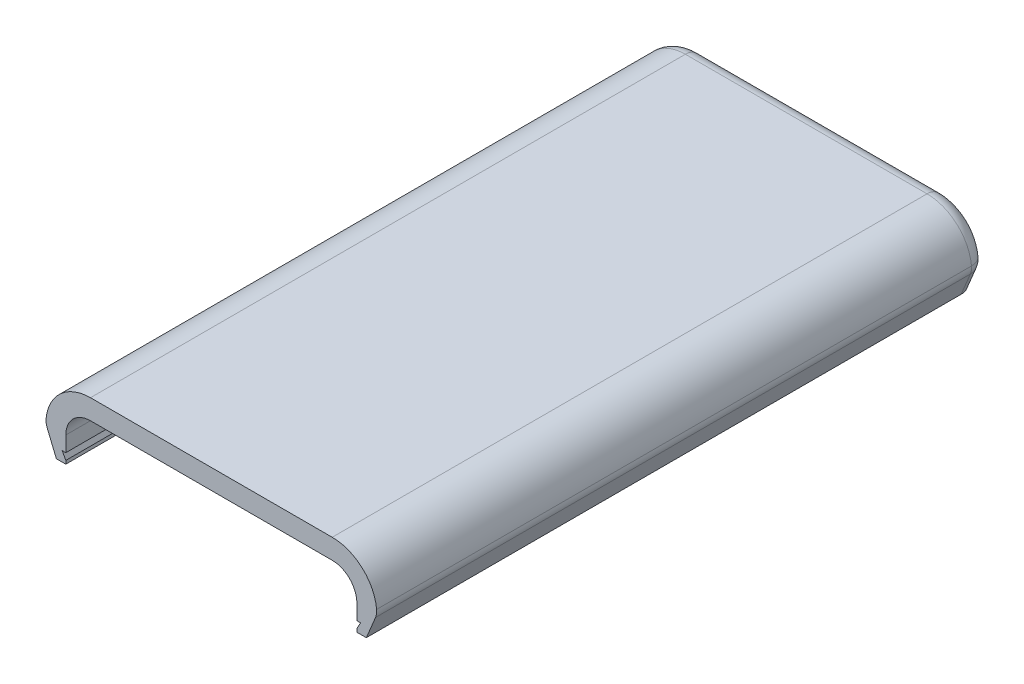
ISO-10303-21;
HEADER;
FILE_DESCRIPTION(('STEP AP214'),'2;1');
FILE_NAME('part.step','',(''),(''),'','','');
FILE_SCHEMA(('AUTOMOTIVE_DESIGN { 1 0 10303 214 1 1 1 1 }'));
ENDSEC;
DATA;
#1=APPLICATION_CONTEXT('core data for automotive mechanical design processes');
#2=APPLICATION_PROTOCOL_DEFINITION('international standard','automotive_design',2000,#1);
#3=PRODUCT_CONTEXT('',#1,'mechanical');
#4=PRODUCT('Part','Part','',(#3));
#5=PRODUCT_RELATED_PRODUCT_CATEGORY('part','',(#4));
#6=PRODUCT_DEFINITION_FORMATION('','',#4);
#7=PRODUCT_DEFINITION_CONTEXT('part definition',#1,'design');
#8=PRODUCT_DEFINITION('design','',#6,#7);
#9=PRODUCT_DEFINITION_SHAPE('','',#8);
#10=(LENGTH_UNIT() NAMED_UNIT(*) SI_UNIT(.MILLI.,.METRE.));
#11=(NAMED_UNIT(*) PLANE_ANGLE_UNIT() SI_UNIT($,.RADIAN.));
#12=(NAMED_UNIT(*) SI_UNIT($,.STERADIAN.) SOLID_ANGLE_UNIT());
#13=UNCERTAINTY_MEASURE_WITH_UNIT(LENGTH_MEASURE(1.E-05),#10,'distance_accuracy_value','');
#14=(GEOMETRIC_REPRESENTATION_CONTEXT(3) GLOBAL_UNCERTAINTY_ASSIGNED_CONTEXT((#13)) GLOBAL_UNIT_ASSIGNED_CONTEXT((#10,
#11,#12)) REPRESENTATION_CONTEXT('',''));
#15=CARTESIAN_POINT('',(0.,0.,0.));
#16=DIRECTION('',(0.,0.,1.));
#17=DIRECTION('',(1.,0.,0.));
#18=AXIS2_PLACEMENT_3D('',#15,#16,#17);
#19=CARTESIAN_POINT('',(0.,0.,116.3));
#20=DIRECTION('',(0.,1.,0.));
#21=DIRECTION('',(0.,0.,1.));
#22=AXIS2_PLACEMENT_3D('',#19,#20,#21);
#23=PLANE('',#22);
#24=DIRECTION('',(0.,0.,-1.));
#25=VECTOR('',#24,1.);
#26=CARTESIAN_POINT('',(0.,0.,116.3));
#27=LINE('',#26,#25);
#28=CARTESIAN_POINT('',(0.,0.,116.3));
#29=VERTEX_POINT('',#28);
#30=CARTESIAN_POINT('',(0.,0.,3.));
#31=VERTEX_POINT('',#30);
#32=EDGE_CURVE('E367',#29,#31,#27,.T.);
#33=ORIENTED_EDGE('',*,*,#32,.T.);
#34=CARTESIAN_POINT('',(3.24800863562673,0.,3.));
#35=DIRECTION('',(0.,1.,0.));
#36=DIRECTION('',(1.,0.,0.));
#37=AXIS2_PLACEMENT_3D('',#34,#35,#36);
#38=ELLIPSE('',#37,3.24800863562673,3.);
#39=CARTESIAN_POINT('',(3.24800863562673,0.,0.));
#40=VERTEX_POINT('',#39);
#41=EDGE_CURVE('E381',#31,#40,#38,.F.);
#42=ORIENTED_EDGE('',*,*,#41,.T.);
#43=DIRECTION('',(1.,0.,0.));
#44=VECTOR('',#43,1.);
#45=CARTESIAN_POINT('',(0.,0.,0.));
#46=LINE('',#45,#44);
#47=CARTESIAN_POINT('',(55.7919913643733,0.,0.));
#48=VERTEX_POINT('',#47);
#49=EDGE_CURVE('E354',#40,#48,#46,.T.);
#50=ORIENTED_EDGE('',*,*,#49,.T.);
#51=CARTESIAN_POINT('',(55.7919913643733,0.,3.));
#52=DIRECTION('',(0.,1.,0.));
#53=DIRECTION('',(1.,0.,0.));
#54=AXIS2_PLACEMENT_3D('',#51,#52,#53);
#55=ELLIPSE('',#54,3.24800863562673,3.);
#56=CARTESIAN_POINT('',(59.04,0.,3.));
#57=VERTEX_POINT('',#56);
#58=EDGE_CURVE('E378',#48,#57,#55,.F.);
#59=ORIENTED_EDGE('',*,*,#58,.T.);
#60=DIRECTION('',(0.,0.,-1.));
#61=VECTOR('',#60,1.);
#62=CARTESIAN_POINT('',(59.04,0.,116.3));
#63=LINE('',#62,#61);
#64=CARTESIAN_POINT('',(59.04,0.,116.3));
#65=VERTEX_POINT('',#64);
#66=EDGE_CURVE('E359',#65,#57,#63,.T.);
#67=ORIENTED_EDGE('',*,*,#66,.F.);
#68=DIRECTION('',(1.,0.,0.));
#69=VECTOR('',#68,1.);
#70=CARTESIAN_POINT('',(0.,0.,116.3));
#71=LINE('',#70,#69);
#72=CARTESIAN_POINT('',(57.24,0.,116.3));
#73=VERTEX_POINT('',#72);
#74=EDGE_CURVE('E360',#73,#65,#71,.T.);
#75=ORIENTED_EDGE('',*,*,#74,.F.);
#76=DIRECTION('',(0.,0.,1.));
#77=VECTOR('',#76,1.);
#78=CARTESIAN_POINT('',(57.24,0.,-57.6317273730364));
#79=LINE('',#78,#77);
#80=CARTESIAN_POINT('',(57.24,0.,3.6));
#81=VERTEX_POINT('',#80);
#82=EDGE_CURVE('E303',#81,#73,#79,.T.);
#83=ORIENTED_EDGE('',*,*,#82,.F.);
#84=DIRECTION('',(1.,0.,0.));
#85=VECTOR('',#84,1.);
#86=CARTESIAN_POINT('',(0.,0.,3.6));
#87=LINE('',#86,#85);
#88=CARTESIAN_POINT('',(1.8,0.,3.6));
#89=VERTEX_POINT('',#88);
#90=EDGE_CURVE('E304',#89,#81,#87,.T.);
#91=ORIENTED_EDGE('',*,*,#90,.F.);
#92=DIRECTION('',(0.,0.,1.));
#93=VECTOR('',#92,1.);
#94=CARTESIAN_POINT('',(1.8,0.,-57.6317273730364));
#95=LINE('',#94,#93);
#96=CARTESIAN_POINT('',(1.8,0.,116.3));
#97=VERTEX_POINT('',#96);
#98=EDGE_CURVE('E308',#89,#97,#95,.T.);
#99=ORIENTED_EDGE('',*,*,#98,.T.);
#100=EDGE_CURVE('E355',#29,#97,#71,.T.);
#101=ORIENTED_EDGE('',*,*,#100,.F.);
#102=EDGE_LOOP('',(#33,#42,#50,#59,#67,#75,#83,#91,#99,#101));
#103=FACE_BOUND('',#102,.T.);
#104=ADVANCED_FACE('F41',(#103),#23,.F.);
#105=CARTESIAN_POINT('',(6.5,4.82,116.3));
#106=DIRECTION('',(0.,0.,-1.));
#107=DIRECTION('',(-1.,0.,0.));
#108=AXIS2_PLACEMENT_3D('',#105,#106,#107);
#109=PLANE('',#108);
#110=CARTESIAN_POINT('',(6.5,4.82,116.3));
#111=DIRECTION('',(0.,0.,1.));
#112=DIRECTION('',(1.,0.,0.));
#113=AXIS2_PLACEMENT_3D('',#110,#111,#112);
#114=CIRCLE('',#113,8.5);
#115=CARTESIAN_POINT('',(6.50000000000006,13.32,116.3));
#116=VERTEX_POINT('',#115);
#117=CARTESIAN_POINT('',(-1.95971024897551,5.64662113654244,116.3));
#118=VERTEX_POINT('',#117);
#119=EDGE_CURVE('E210',#116,#118,#114,.T.);
#120=ORIENTED_EDGE('',*,*,#119,.T.);
#121=CARTESIAN_POINT('',(1.0260698388982,5.3548725001157,116.3));
#122=DIRECTION('',(0.,0.,-1.));
#123=DIRECTION('',(-1.,0.,0.));
#124=AXIS2_PLACEMENT_3D('',#121,#122,#123);
#125=CIRCLE('',#124,3.);
#126=CARTESIAN_POINT('',(-1.7448587544808,4.20510959829867,116.3));
#127=VERTEX_POINT('',#126);
#128=EDGE_CURVE('E407',#118,#127,#125,.F.);
#129=ORIENTED_EDGE('',*,*,#128,.T.);
#130=DIRECTION('',(0.383254300605675,-0.923642864459665,0.));
#131=VECTOR('',#130,1.);
#132=CARTESIAN_POINT('',(-2.,4.81999999999995,116.3));
#133=LINE('',#132,#131);
#134=EDGE_CURVE('E217',#127,#29,#133,.T.);
#135=ORIENTED_EDGE('',*,*,#134,.T.);
#136=ORIENTED_EDGE('',*,*,#100,.T.);
#137=DIRECTION('',(0.,-1.,0.));
#138=VECTOR('',#137,1.);
#139=CARTESIAN_POINT('',(1.8,0.,116.3));
#140=LINE('',#139,#138);
#141=CARTESIAN_POINT('',(1.8,0.63,116.3));
#142=VERTEX_POINT('',#141);
#143=EDGE_CURVE('E254',#142,#97,#140,.T.);
#144=ORIENTED_EDGE('',*,*,#143,.F.);
#145=DIRECTION('',(0.482712704899111,-0.875778764602673,0.));
#146=VECTOR('',#145,1.);
#147=CARTESIAN_POINT('',(1.64691140805554,0.907746445384945,116.3));
#148=LINE('',#147,#146);
#149=CARTESIAN_POINT('',(1.1,1.9,116.3));
#150=VERTEX_POINT('',#149);
#151=EDGE_CURVE('E255',#150,#142,#148,.T.);
#152=ORIENTED_EDGE('',*,*,#151,.F.);
#153=DIRECTION('',(-1.,0.,0.));
#154=VECTOR('',#153,1.);
#155=CARTESIAN_POINT('',(0.,1.9,116.3));
#156=LINE('',#155,#154);
#157=CARTESIAN_POINT('',(1.8,1.9,116.3));
#158=VERTEX_POINT('',#157);
#159=EDGE_CURVE('E259',#158,#150,#156,.T.);
#160=ORIENTED_EDGE('',*,*,#159,.F.);
#161=CARTESIAN_POINT('',(1.8,4.81999999999996,116.3));
#162=VERTEX_POINT('',#161);
#163=EDGE_CURVE('E263',#162,#158,#140,.T.);
#164=ORIENTED_EDGE('',*,*,#163,.F.);
#165=CARTESIAN_POINT('',(6.5,4.82,116.3));
#166=DIRECTION('',(0.,0.,1.));
#167=DIRECTION('',(1.,0.,0.));
#168=AXIS2_PLACEMENT_3D('',#165,#166,#167);
#169=CIRCLE('',#168,4.7);
#170=CARTESIAN_POINT('',(6.50000000000003,9.52,116.3));
#171=VERTEX_POINT('',#170);
#172=EDGE_CURVE('E267',#171,#162,#169,.T.);
#173=ORIENTED_EDGE('',*,*,#172,.F.);
#174=DIRECTION('',(-1.,0.,0.));
#175=VECTOR('',#174,1.);
#176=CARTESIAN_POINT('',(0.,9.52,116.3));
#177=LINE('',#176,#175);
#178=CARTESIAN_POINT('',(52.54,9.52,116.3));
#179=VERTEX_POINT('',#178);
#180=EDGE_CURVE('E271',#179,#171,#177,.T.);
#181=ORIENTED_EDGE('',*,*,#180,.F.);
#182=CARTESIAN_POINT('',(52.54,4.82,116.3));
#183=DIRECTION('',(0.,0.,1.));
#184=DIRECTION('',(1.,0.,0.));
#185=AXIS2_PLACEMENT_3D('',#182,#183,#184);
#186=CIRCLE('',#185,4.7);
#187=CARTESIAN_POINT('',(57.24,4.81999999999997,116.3));
#188=VERTEX_POINT('',#187);
#189=EDGE_CURVE('E234',#188,#179,#186,.T.);
#190=ORIENTED_EDGE('',*,*,#189,.F.);
#191=DIRECTION('',(0.,1.,0.));
#192=VECTOR('',#191,1.);
#193=CARTESIAN_POINT('',(57.24,0.,116.3));
#194=LINE('',#193,#192);
#195=CARTESIAN_POINT('',(57.24,1.90000000000001,116.3));
#196=VERTEX_POINT('',#195);
#197=EDGE_CURVE('E238',#196,#188,#194,.T.);
#198=ORIENTED_EDGE('',*,*,#197,.F.);
#199=DIRECTION('',(1.,0.,0.));
#200=VECTOR('',#199,1.);
#201=CARTESIAN_POINT('',(0.,1.90000000000004,116.3));
#202=LINE('',#201,#200);
#203=CARTESIAN_POINT('',(57.94,1.90000000000001,116.3));
#204=VERTEX_POINT('',#203);
#205=EDGE_CURVE('E239',#196,#204,#202,.T.);
#206=ORIENTED_EDGE('',*,*,#205,.T.);
#207=DIRECTION('',(-0.482712704899112,-0.875778764602672,0.));
#208=VECTOR('',#207,1.);
#209=CARTESIAN_POINT('',(43.6360863569356,-24.0513861809882,116.3));
#210=LINE('',#209,#208);
#211=CARTESIAN_POINT('',(57.24,0.63000000000001,116.3));
#212=VERTEX_POINT('',#211);
#213=EDGE_CURVE('E245',#204,#212,#210,.T.);
#214=ORIENTED_EDGE('',*,*,#213,.T.);
#215=EDGE_CURVE('E250',#73,#212,#194,.T.);
#216=ORIENTED_EDGE('',*,*,#215,.F.);
#217=ORIENTED_EDGE('',*,*,#74,.T.);
#218=DIRECTION('',(0.383254300605675,0.923642864459665,0.));
#219=VECTOR('',#218,1.);
#220=CARTESIAN_POINT('',(61.04,4.81999999999994,116.3));
#221=LINE('',#220,#219);
#222=CARTESIAN_POINT('',(60.7848587544808,4.20510959829867,116.3));
#223=VERTEX_POINT('',#222);
#224=EDGE_CURVE('E225',#65,#223,#221,.T.);
#225=ORIENTED_EDGE('',*,*,#224,.T.);
#226=CARTESIAN_POINT('',(58.0139301611018,5.35487250011569,116.3));
#227=DIRECTION('',(0.,0.,-1.));
#228=DIRECTION('',(-1.,0.,0.));
#229=AXIS2_PLACEMENT_3D('',#226,#227,#228);
#230=CIRCLE('',#229,3.);
#231=CARTESIAN_POINT('',(60.9997102489755,5.64662113654243,116.3));
#232=VERTEX_POINT('',#231);
#233=EDGE_CURVE('E404',#223,#232,#230,.F.);
#234=ORIENTED_EDGE('',*,*,#233,.T.);
#235=CARTESIAN_POINT('',(52.54,4.82,116.3));
#236=DIRECTION('',(0.,0.,1.));
#237=DIRECTION('',(1.,0.,0.));
#238=AXIS2_PLACEMENT_3D('',#235,#236,#237);
#239=CIRCLE('',#238,8.5);
#240=CARTESIAN_POINT('',(52.54,13.32,116.3));
#241=VERTEX_POINT('',#240);
#242=EDGE_CURVE('E221',#232,#241,#239,.T.);
#243=ORIENTED_EDGE('',*,*,#242,.T.);
#244=DIRECTION('',(-1.,0.,0.));
#245=VECTOR('',#244,1.);
#246=CARTESIAN_POINT('',(52.54,13.32,116.3));
#247=LINE('',#246,#245);
#248=EDGE_CURVE('E201',#241,#116,#247,.T.);
#249=ORIENTED_EDGE('',*,*,#248,.T.);
#250=EDGE_LOOP('',(#120,#129,#135,#136,#144,#152,#160,#164,#173,#181,#190,#198,#206,#214,#216,
#217,#225,#234,#243,#249));
#251=FACE_BOUND('',#250,.T.);
#252=ADVANCED_FACE('F220',(#251),#109,.F.);
#253=CARTESIAN_POINT('',(6.5,4.82,0.));
#254=DIRECTION('',(0.,0.,-1.));
#255=DIRECTION('',(-1.,0.,0.));
#256=AXIS2_PLACEMENT_3D('',#253,#254,#255);
#257=PLANE('',#256);
#258=ORIENTED_EDGE('',*,*,#49,.F.);
#259=DIRECTION('',(0.383254300605675,-0.923642864459665,0.));
#260=VECTOR('',#259,1.);
#261=CARTESIAN_POINT('',(2.01944139430731,2.96084705157978,0.));
#262=LINE('',#261,#260);
#263=CARTESIAN_POINT('',(1.0260698388982,5.3548725001157,0.));
#264=VERTEX_POINT('',#263);
#265=EDGE_CURVE('E396',#40,#264,#262,.F.);
#266=ORIENTED_EDGE('',*,*,#265,.T.);
#267=CARTESIAN_POINT('',(6.5,4.82,0.));
#268=DIRECTION('',(0.,0.,-1.));
#269=DIRECTION('',(-1.,0.,0.));
#270=AXIS2_PLACEMENT_3D('',#267,#268,#269);
#271=CIRCLE('',#270,5.5);
#272=CARTESIAN_POINT('',(6.50000000000004,10.32,0.));
#273=VERTEX_POINT('',#272);
#274=EDGE_CURVE('E390',#264,#273,#271,.T.);
#275=ORIENTED_EDGE('',*,*,#274,.T.);
#276=DIRECTION('',(-1.,0.,0.));
#277=VECTOR('',#276,1.);
#278=CARTESIAN_POINT('',(6.5,10.32,0.));
#279=LINE('',#278,#277);
#280=CARTESIAN_POINT('',(52.54,10.32,0.));
#281=VERTEX_POINT('',#280);
#282=EDGE_CURVE('E384',#273,#281,#279,.F.);
#283=ORIENTED_EDGE('',*,*,#282,.T.);
#284=CARTESIAN_POINT('',(52.54,4.82,0.));
#285=DIRECTION('',(0.,0.,-1.));
#286=DIRECTION('',(-1.,0.,0.));
#287=AXIS2_PLACEMENT_3D('',#284,#285,#286);
#288=CIRCLE('',#287,5.5);
#289=CARTESIAN_POINT('',(58.0139301611018,5.3548725001157,0.));
#290=VERTEX_POINT('',#289);
#291=EDGE_CURVE('E387',#281,#290,#288,.T.);
#292=ORIENTED_EDGE('',*,*,#291,.T.);
#293=DIRECTION('',(0.383254300605675,0.923642864459665,0.));
#294=VECTOR('',#293,1.);
#295=CARTESIAN_POINT('',(50.2580257404291,-13.3368571537053,0.));
#296=LINE('',#295,#294);
#297=EDGE_CURVE('E393',#290,#48,#296,.F.);
#298=ORIENTED_EDGE('',*,*,#297,.T.);
#299=EDGE_LOOP('',(#258,#266,#275,#283,#292,#298));
#300=FACE_BOUND('',#299,.T.);
#301=ADVANCED_FACE('F510',(#300),#257,.T.);
#302=CARTESIAN_POINT('',(6.5,4.82,3.6));
#303=DIRECTION('',(0.,0.,-1.));
#304=DIRECTION('',(-1.,0.,0.));
#305=AXIS2_PLACEMENT_3D('',#302,#303,#304);
#306=PLANE('',#305);
#307=DIRECTION('',(-1.,0.,0.));
#308=VECTOR('',#307,1.);
#309=CARTESIAN_POINT('',(0.,9.52,3.6));
#310=LINE('',#309,#308);
#311=CARTESIAN_POINT('',(52.54,9.52,3.6));
#312=VERTEX_POINT('',#311);
#313=CARTESIAN_POINT('',(6.50000000000003,9.52,3.6));
#314=VERTEX_POINT('',#313);
#315=EDGE_CURVE('E280',#312,#314,#310,.T.);
#316=ORIENTED_EDGE('',*,*,#315,.T.);
#317=CARTESIAN_POINT('',(6.5,4.82,3.6));
#318=DIRECTION('',(0.,0.,-1.));
#319=DIRECTION('',(-1.,0.,0.));
#320=AXIS2_PLACEMENT_3D('',#317,#318,#319);
#321=CIRCLE('',#320,4.7);
#322=CARTESIAN_POINT('',(1.8,4.81999999999996,3.6));
#323=VERTEX_POINT('',#322);
#324=EDGE_CURVE('E237',#314,#323,#321,.F.);
#325=ORIENTED_EDGE('',*,*,#324,.T.);
#326=DIRECTION('',(0.,-1.,0.));
#327=VECTOR('',#326,1.);
#328=CARTESIAN_POINT('',(1.8,0.,3.6));
#329=LINE('',#328,#327);
#330=CARTESIAN_POINT('',(1.8,1.9,3.6));
#331=VERTEX_POINT('',#330);
#332=EDGE_CURVE('E324',#323,#331,#329,.T.);
#333=ORIENTED_EDGE('',*,*,#332,.T.);
#334=DIRECTION('',(-1.,0.,0.));
#335=VECTOR('',#334,1.);
#336=CARTESIAN_POINT('',(0.,1.9,3.6));
#337=LINE('',#336,#335);
#338=CARTESIAN_POINT('',(1.1,1.9,3.6));
#339=VERTEX_POINT('',#338);
#340=EDGE_CURVE('E319',#331,#339,#337,.T.);
#341=ORIENTED_EDGE('',*,*,#340,.T.);
#342=DIRECTION('',(0.482712704899111,-0.875778764602673,0.));
#343=VECTOR('',#342,1.);
#344=CARTESIAN_POINT('',(1.64691140805554,0.907746445384945,3.6));
#345=LINE('',#344,#343);
#346=CARTESIAN_POINT('',(1.8,0.63,3.6));
#347=VERTEX_POINT('',#346);
#348=EDGE_CURVE('E314',#339,#347,#345,.T.);
#349=ORIENTED_EDGE('',*,*,#348,.T.);
#350=DIRECTION('',(0.,-1.,0.));
#351=VECTOR('',#350,1.);
#352=CARTESIAN_POINT('',(1.8,0.,3.6));
#353=LINE('',#352,#351);
#354=EDGE_CURVE('E309',#347,#89,#353,.T.);
#355=ORIENTED_EDGE('',*,*,#354,.T.);
#356=ORIENTED_EDGE('',*,*,#90,.T.);
#357=DIRECTION('',(0.,1.,0.));
#358=VECTOR('',#357,1.);
#359=CARTESIAN_POINT('',(57.24,0.,3.6));
#360=LINE('',#359,#358);
#361=CARTESIAN_POINT('',(57.24,0.63000000000001,3.6));
#362=VERTEX_POINT('',#361);
#363=EDGE_CURVE('E298',#81,#362,#360,.T.);
#364=ORIENTED_EDGE('',*,*,#363,.T.);
#365=DIRECTION('',(-0.482712704899112,-0.875778764602672,0.));
#366=VECTOR('',#365,1.);
#367=CARTESIAN_POINT('',(43.6360863569356,-24.0513861809882,3.6));
#368=LINE('',#367,#366);
#369=CARTESIAN_POINT('',(57.94,1.90000000000001,3.6));
#370=VERTEX_POINT('',#369);
#371=EDGE_CURVE('E275',#370,#362,#368,.T.);
#372=ORIENTED_EDGE('',*,*,#371,.F.);
#373=DIRECTION('',(1.,0.,0.));
#374=VECTOR('',#373,1.);
#375=CARTESIAN_POINT('',(0.,1.90000000000004,3.6));
#376=LINE('',#375,#374);
#377=CARTESIAN_POINT('',(57.24,1.90000000000001,3.6));
#378=VERTEX_POINT('',#377);
#379=EDGE_CURVE('E206',#378,#370,#376,.T.);
#380=ORIENTED_EDGE('',*,*,#379,.F.);
#381=DIRECTION('',(0.,1.,0.));
#382=VECTOR('',#381,1.);
#383=CARTESIAN_POINT('',(57.24,0.,3.6));
#384=LINE('',#383,#382);
#385=CARTESIAN_POINT('',(57.24,4.81999999999997,3.6));
#386=VERTEX_POINT('',#385);
#387=EDGE_CURVE('E243',#378,#386,#384,.T.);
#388=ORIENTED_EDGE('',*,*,#387,.T.);
#389=CARTESIAN_POINT('',(52.54,4.82,3.6));
#390=DIRECTION('',(0.,0.,-1.));
#391=DIRECTION('',(-1.,0.,0.));
#392=AXIS2_PLACEMENT_3D('',#389,#390,#391);
#393=CIRCLE('',#392,4.7);
#394=EDGE_CURVE('E286',#386,#312,#393,.F.);
#395=ORIENTED_EDGE('',*,*,#394,.T.);
#396=EDGE_LOOP('',(#316,#325,#333,#341,#349,#355,#356,#364,#372,#380,#388,#395));
#397=FACE_BOUND('',#396,.T.);
#398=ADVANCED_FACE('F588',(#397),#306,.F.);
#399=CARTESIAN_POINT('',(6.5,4.82,-57.6317273730364));
#400=DIRECTION('',(0.,0.,1.));
#401=DIRECTION('',(1.,0.,0.));
#402=AXIS2_PLACEMENT_3D('',#399,#400,#401);
#403=CYLINDRICAL_SURFACE('',#402,4.7);
#404=DIRECTION('',(0.,0.,1.));
#405=VECTOR('',#404,1.);
#406=CARTESIAN_POINT('',(6.50000000000003,9.52,-57.6317273730364));
#407=LINE('',#406,#405);
#408=EDGE_CURVE('E284',#314,#171,#407,.T.);
#409=ORIENTED_EDGE('',*,*,#408,.T.);
#410=ORIENTED_EDGE('',*,*,#172,.T.);
#411=DIRECTION('',(0.,0.,1.));
#412=VECTOR('',#411,1.);
#413=CARTESIAN_POINT('',(1.8,4.81999999999996,-57.6317273730364));
#414=LINE('',#413,#412);
#415=EDGE_CURVE('E279',#323,#162,#414,.T.);
#416=ORIENTED_EDGE('',*,*,#415,.F.);
#417=ORIENTED_EDGE('',*,*,#324,.F.);
#418=EDGE_LOOP('',(#409,#410,#416,#417));
#419=FACE_BOUND('',#418,.T.);
#420=ADVANCED_FACE('F563',(#419),#403,.F.);
#421=CARTESIAN_POINT('',(1.8,0.,-57.6317273730364));
#422=DIRECTION('',(-1.,0.,0.));
#423=DIRECTION('',(0.,0.,1.));
#424=AXIS2_PLACEMENT_3D('',#421,#422,#423);
#425=PLANE('',#424);
#426=ORIENTED_EDGE('',*,*,#415,.T.);
#427=ORIENTED_EDGE('',*,*,#163,.T.);
#428=DIRECTION('',(0.,0.,1.));
#429=VECTOR('',#428,1.);
#430=CARTESIAN_POINT('',(1.8,1.9,-57.6317273730364));
#431=LINE('',#430,#429);
#432=EDGE_CURVE('E323',#331,#158,#431,.T.);
#433=ORIENTED_EDGE('',*,*,#432,.F.);
#434=ORIENTED_EDGE('',*,*,#332,.F.);
#435=EDGE_LOOP('',(#426,#427,#433,#434));
#436=FACE_BOUND('',#435,.T.);
#437=ADVANCED_FACE('F560',(#436),#425,.F.);
#438=CARTESIAN_POINT('',(0.,1.9,-57.6317273730364));
#439=DIRECTION('',(0.,1.,0.));
#440=DIRECTION('',(-1.,0.,0.));
#441=AXIS2_PLACEMENT_3D('',#438,#439,#440);
#442=PLANE('',#441);
#443=ORIENTED_EDGE('',*,*,#432,.T.);
#444=ORIENTED_EDGE('',*,*,#159,.T.);
#445=DIRECTION('',(0.,0.,1.));
#446=VECTOR('',#445,1.);
#447=CARTESIAN_POINT('',(1.1,1.9,-57.6317273730364));
#448=LINE('',#447,#446);
#449=EDGE_CURVE('E318',#339,#150,#448,.T.);
#450=ORIENTED_EDGE('',*,*,#449,.F.);
#451=ORIENTED_EDGE('',*,*,#340,.F.);
#452=EDGE_LOOP('',(#443,#444,#450,#451));
#453=FACE_BOUND('',#452,.T.);
#454=ADVANCED_FACE('F554',(#453),#442,.F.);
#455=CARTESIAN_POINT('',(1.64691140805554,0.907746445384945,-57.6317273730364));
#456=DIRECTION('',(-0.875778764602673,-0.482712704899111,0.));
#457=DIRECTION('',(0.482712704899111,-0.875778764602673,0.));
#458=AXIS2_PLACEMENT_3D('',#455,#456,#457);
#459=PLANE('',#458);
#460=ORIENTED_EDGE('',*,*,#449,.T.);
#461=ORIENTED_EDGE('',*,*,#151,.T.);
#462=DIRECTION('',(0.,0.,1.));
#463=VECTOR('',#462,1.);
#464=CARTESIAN_POINT('',(1.8,0.63,-57.6317273730364));
#465=LINE('',#464,#463);
#466=EDGE_CURVE('E313',#347,#142,#465,.T.);
#467=ORIENTED_EDGE('',*,*,#466,.F.);
#468=ORIENTED_EDGE('',*,*,#348,.F.);
#469=EDGE_LOOP('',(#460,#461,#467,#468));
#470=FACE_BOUND('',#469,.T.);
#471=ADVANCED_FACE('F551',(#470),#459,.F.);
#472=ORIENTED_EDGE('',*,*,#466,.T.);
#473=ORIENTED_EDGE('',*,*,#143,.T.);
#474=ORIENTED_EDGE('',*,*,#98,.F.);
#475=ORIENTED_EDGE('',*,*,#354,.F.);
#476=EDGE_LOOP('',(#472,#473,#474,#475));
#477=FACE_BOUND('',#476,.T.);
#478=ADVANCED_FACE('F548',(#477),#425,.F.);
#479=CARTESIAN_POINT('',(57.24,0.,-57.6317273730364));
#480=DIRECTION('',(1.,0.,0.));
#481=DIRECTION('',(0.,0.,-1.));
#482=AXIS2_PLACEMENT_3D('',#479,#480,#481);
#483=PLANE('',#482);
#484=ORIENTED_EDGE('',*,*,#82,.T.);
#485=ORIENTED_EDGE('',*,*,#215,.T.);
#486=DIRECTION('',(0.,0.,1.));
#487=VECTOR('',#486,1.);
#488=CARTESIAN_POINT('',(57.24,0.63000000000001,-57.6317273730364));
#489=LINE('',#488,#487);
#490=EDGE_CURVE('E302',#362,#212,#489,.T.);
#491=ORIENTED_EDGE('',*,*,#490,.F.);
#492=ORIENTED_EDGE('',*,*,#363,.F.);
#493=EDGE_LOOP('',(#484,#485,#491,#492));
#494=FACE_BOUND('',#493,.T.);
#495=ADVANCED_FACE('F586',(#494),#483,.F.);
#496=CARTESIAN_POINT('',(43.6360863569356,-24.0513861809882,-57.6317273730364));
#497=DIRECTION('',(-0.875778764602672,0.482712704899112,0.));
#498=DIRECTION('',(-0.482712704899112,-0.875778764602672,0.));
#499=AXIS2_PLACEMENT_3D('',#496,#497,#498);
#500=PLANE('',#499);
#501=ORIENTED_EDGE('',*,*,#371,.T.);
#502=ORIENTED_EDGE('',*,*,#490,.T.);
#503=ORIENTED_EDGE('',*,*,#213,.F.);
#504=DIRECTION('',(0.,0.,1.));
#505=VECTOR('',#504,1.);
#506=CARTESIAN_POINT('',(57.94,1.90000000000001,-57.6317273730364));
#507=LINE('',#506,#505);
#508=EDGE_CURVE('E249',#370,#204,#507,.T.);
#509=ORIENTED_EDGE('',*,*,#508,.F.);
#510=EDGE_LOOP('',(#501,#502,#503,#509));
#511=FACE_BOUND('',#510,.T.);
#512=ADVANCED_FACE('F582',(#511),#500,.T.);
#513=CARTESIAN_POINT('',(0.,1.90000000000004,-57.6317273730364));
#514=DIRECTION('',(0.,-1.,0.));
#515=DIRECTION('',(1.,0.,0.));
#516=AXIS2_PLACEMENT_3D('',#513,#514,#515);
#517=PLANE('',#516);
#518=ORIENTED_EDGE('',*,*,#379,.T.);
#519=ORIENTED_EDGE('',*,*,#508,.T.);
#520=ORIENTED_EDGE('',*,*,#205,.F.);
#521=DIRECTION('',(0.,0.,1.));
#522=VECTOR('',#521,1.);
#523=CARTESIAN_POINT('',(57.24,1.90000000000001,-57.6317273730364));
#524=LINE('',#523,#522);
#525=EDGE_CURVE('E244',#378,#196,#524,.T.);
#526=ORIENTED_EDGE('',*,*,#525,.F.);
#527=EDGE_LOOP('',(#518,#519,#520,#526));
#528=FACE_BOUND('',#527,.T.);
#529=ADVANCED_FACE('F578',(#528),#517,.T.);
#530=ORIENTED_EDGE('',*,*,#525,.T.);
#531=ORIENTED_EDGE('',*,*,#197,.T.);
#532=DIRECTION('',(0.,0.,1.));
#533=VECTOR('',#532,1.);
#534=CARTESIAN_POINT('',(57.24,4.81999999999997,-57.6317273730364));
#535=LINE('',#534,#533);
#536=EDGE_CURVE('E290',#386,#188,#535,.T.);
#537=ORIENTED_EDGE('',*,*,#536,.F.);
#538=ORIENTED_EDGE('',*,*,#387,.F.);
#539=EDGE_LOOP('',(#530,#531,#537,#538));
#540=FACE_BOUND('',#539,.T.);
#541=ADVANCED_FACE('F573',(#540),#483,.F.);
#542=CARTESIAN_POINT('',(52.54,4.82,-57.6317273730364));
#543=DIRECTION('',(0.,0.,1.));
#544=DIRECTION('',(1.,0.,0.));
#545=AXIS2_PLACEMENT_3D('',#542,#543,#544);
#546=CYLINDRICAL_SURFACE('',#545,4.7);
#547=ORIENTED_EDGE('',*,*,#536,.T.);
#548=ORIENTED_EDGE('',*,*,#189,.T.);
#549=DIRECTION('',(0.,0.,1.));
#550=VECTOR('',#549,1.);
#551=CARTESIAN_POINT('',(52.54,9.52,-57.6317273730364));
#552=LINE('',#551,#550);
#553=EDGE_CURVE('E285',#312,#179,#552,.T.);
#554=ORIENTED_EDGE('',*,*,#553,.F.);
#555=ORIENTED_EDGE('',*,*,#394,.F.);
#556=EDGE_LOOP('',(#547,#548,#554,#555));
#557=FACE_BOUND('',#556,.T.);
#558=ADVANCED_FACE('F570',(#557),#546,.F.);
#559=CARTESIAN_POINT('',(0.,9.52,-57.6317273730364));
#560=DIRECTION('',(0.,1.,0.));
#561=DIRECTION('',(0.,0.,1.));
#562=AXIS2_PLACEMENT_3D('',#559,#560,#561);
#563=PLANE('',#562);
#564=ORIENTED_EDGE('',*,*,#553,.T.);
#565=ORIENTED_EDGE('',*,*,#180,.T.);
#566=ORIENTED_EDGE('',*,*,#408,.F.);
#567=ORIENTED_EDGE('',*,*,#315,.F.);
#568=EDGE_LOOP('',(#564,#565,#566,#567));
#569=FACE_BOUND('',#568,.T.);
#570=ADVANCED_FACE('F503',(#569),#563,.F.);
#571=CARTESIAN_POINT('',(61.04,4.81999999999994,-64.431855475378));
#572=DIRECTION('',(0.923642864459665,-0.383254300605675,0.));
#573=DIRECTION('',(0.383254300605675,0.923642864459665,0.));
#574=AXIS2_PLACEMENT_3D('',#571,#572,#573);
#575=PLANE('',#574);
#576=DIRECTION('',(0.383254300605675,0.923642864459665,0.));
#577=VECTOR('',#576,1.);
#578=CARTESIAN_POINT('',(61.04,4.81999999999994,3.));
#579=LINE('',#578,#577);
#580=CARTESIAN_POINT('',(60.7848587544808,4.20510959829867,3.));
#581=VERTEX_POINT('',#580);
#582=EDGE_CURVE('E410',#57,#581,#579,.T.);
#583=ORIENTED_EDGE('',*,*,#582,.T.);
#584=DIRECTION('',(0.,0.,1.));
#585=VECTOR('',#584,1.);
#586=CARTESIAN_POINT('',(60.7848587544808,4.20510959829867,-64.431855475378));
#587=LINE('',#586,#585);
#588=EDGE_CURVE('E413',#581,#223,#587,.T.);
#589=ORIENTED_EDGE('',*,*,#588,.T.);
#590=ORIENTED_EDGE('',*,*,#224,.F.);
#591=ORIENTED_EDGE('',*,*,#66,.T.);
#592=EDGE_LOOP('',(#583,#589,#590,#591));
#593=FACE_BOUND('',#592,.T.);
#594=ADVANCED_FACE('F491',(#593),#575,.T.);
#595=CARTESIAN_POINT('',(52.54,4.82,-64.431855475378));
#596=DIRECTION('',(0.,0.,1.));
#597=DIRECTION('',(1.,0.,0.));
#598=AXIS2_PLACEMENT_3D('',#595,#596,#597);
#599=CYLINDRICAL_SURFACE('',#598,8.5);
#600=ORIENTED_EDGE('',*,*,#242,.F.);
#601=DIRECTION('',(0.,0.,1.));
#602=VECTOR('',#601,1.);
#603=CARTESIAN_POINT('',(60.9997102489755,5.64662113654243,-64.431855475378));
#604=LINE('',#603,#602);
#605=CARTESIAN_POINT('',(60.9997102489755,5.64662113654243,3.));
#606=VERTEX_POINT('',#605);
#607=EDGE_CURVE('E51',#232,#606,#604,.F.);
#608=ORIENTED_EDGE('',*,*,#607,.T.);
#609=CARTESIAN_POINT('',(52.54,4.82,3.));
#610=DIRECTION('',(0.,0.,-1.));
#611=DIRECTION('',(-1.,0.,0.));
#612=AXIS2_PLACEMENT_3D('',#609,#610,#611);
#613=CIRCLE('',#612,8.5);
#614=CARTESIAN_POINT('',(52.54,13.32,3.));
#615=VERTEX_POINT('',#614);
#616=EDGE_CURVE('E63',#606,#615,#613,.F.);
#617=ORIENTED_EDGE('',*,*,#616,.T.);
#618=DIRECTION('',(0.,0.,1.));
#619=VECTOR('',#618,1.);
#620=CARTESIAN_POINT('',(52.54,13.32,-64.431855475378));
#621=LINE('',#620,#619);
#622=EDGE_CURVE('E207',#615,#241,#621,.T.);
#623=ORIENTED_EDGE('',*,*,#622,.T.);
#624=EDGE_LOOP('',(#600,#608,#617,#623));
#625=FACE_BOUND('',#624,.T.);
#626=ADVANCED_FACE('F495',(#625),#599,.T.);
#627=CARTESIAN_POINT('',(52.54,13.32,-64.431855475378));
#628=DIRECTION('',(0.,1.,0.));
#629=DIRECTION('',(0.,0.,1.));
#630=AXIS2_PLACEMENT_3D('',#627,#628,#629);
#631=PLANE('',#630);
#632=ORIENTED_EDGE('',*,*,#622,.F.);
#633=DIRECTION('',(-1.,0.,0.));
#634=VECTOR('',#633,1.);
#635=CARTESIAN_POINT('',(52.54,13.32,3.));
#636=LINE('',#635,#634);
#637=CARTESIAN_POINT('',(6.50000000000006,13.32,3.));
#638=VERTEX_POINT('',#637);
#639=EDGE_CURVE('E12',#615,#638,#636,.T.);
#640=ORIENTED_EDGE('',*,*,#639,.T.);
#641=DIRECTION('',(0.,0.,1.));
#642=VECTOR('',#641,1.);
#643=CARTESIAN_POINT('',(6.50000000000006,13.32,-64.431855475378));
#644=LINE('',#643,#642);
#645=EDGE_CURVE('E197',#638,#116,#644,.T.);
#646=ORIENTED_EDGE('',*,*,#645,.T.);
#647=ORIENTED_EDGE('',*,*,#248,.F.);
#648=EDGE_LOOP('',(#632,#640,#646,#647));
#649=FACE_BOUND('',#648,.T.);
#650=ADVANCED_FACE('F199',(#649),#631,.T.);
#651=CARTESIAN_POINT('',(6.5,4.82,-64.431855475378));
#652=DIRECTION('',(0.,0.,1.));
#653=DIRECTION('',(1.,0.,0.));
#654=AXIS2_PLACEMENT_3D('',#651,#652,#653);
#655=CYLINDRICAL_SURFACE('',#654,8.5);
#656=CARTESIAN_POINT('',(6.5,4.82,3.));
#657=DIRECTION('',(0.,0.,-1.));
#658=DIRECTION('',(-1.,0.,0.));
#659=AXIS2_PLACEMENT_3D('',#656,#657,#658);
#660=CIRCLE('',#659,8.5);
#661=CARTESIAN_POINT('',(-1.95971024897551,5.64662113654244,3.));
#662=VERTEX_POINT('',#661);
#663=EDGE_CURVE('E399',#638,#662,#660,.F.);
#664=ORIENTED_EDGE('',*,*,#663,.T.);
#665=DIRECTION('',(0.,0.,1.));
#666=VECTOR('',#665,1.);
#667=CARTESIAN_POINT('',(-1.95971024897551,5.64662113654244,-64.431855475378));
#668=LINE('',#667,#666);
#669=EDGE_CURVE('E213',#662,#118,#668,.T.);
#670=ORIENTED_EDGE('',*,*,#669,.T.);
#671=ORIENTED_EDGE('',*,*,#119,.F.);
#672=ORIENTED_EDGE('',*,*,#645,.F.);
#673=EDGE_LOOP('',(#664,#670,#671,#672));
#674=FACE_BOUND('',#673,.T.);
#675=ADVANCED_FACE('F211',(#674),#655,.T.);
#676=CARTESIAN_POINT('',(-2.,4.81999999999995,-64.431855475378));
#677=DIRECTION('',(-0.923642864459665,-0.383254300605675,0.));
#678=DIRECTION('',(0.383254300605675,-0.923642864459665,0.));
#679=AXIS2_PLACEMENT_3D('',#676,#677,#678);
#680=PLANE('',#679);
#681=DIRECTION('',(0.,0.,1.));
#682=VECTOR('',#681,1.);
#683=CARTESIAN_POINT('',(-1.7448587544808,4.20510959829867,-64.431855475378));
#684=LINE('',#683,#682);
#685=CARTESIAN_POINT('',(-1.7448587544808,4.20510959829867,3.));
#686=VERTEX_POINT('',#685);
#687=EDGE_CURVE('E371',#127,#686,#684,.F.);
#688=ORIENTED_EDGE('',*,*,#687,.T.);
#689=DIRECTION('',(0.383254300605675,-0.923642864459665,0.));
#690=VECTOR('',#689,1.);
#691=CARTESIAN_POINT('',(-2.,4.81999999999995,3.));
#692=LINE('',#691,#690);
#693=EDGE_CURVE('E374',#686,#31,#692,.T.);
#694=ORIENTED_EDGE('',*,*,#693,.T.);
#695=ORIENTED_EDGE('',*,*,#32,.F.);
#696=ORIENTED_EDGE('',*,*,#134,.F.);
#697=EDGE_LOOP('',(#688,#694,#695,#696));
#698=FACE_BOUND('',#697,.T.);
#699=ADVANCED_FACE('F476',(#698),#680,.T.);
#700=CARTESIAN_POINT('',(58.269071406621,5.96976290181696,3.));
#701=DIRECTION('',(0.383254300605675,0.923642864459665,0.));
#702=DIRECTION('',(-0.923642864459665,0.383254300605675,0.));
#703=AXIS2_PLACEMENT_3D('',#700,#701,#702);
#704=CYLINDRICAL_SURFACE('',#703,3.);
#705=ORIENTED_EDGE('',*,*,#58,.F.);
#706=ORIENTED_EDGE('',*,*,#297,.F.);
#707=CARTESIAN_POINT('',(58.0139301611018,5.35487250011569,3.));
#708=DIRECTION('',(0.383254300605675,0.923642864459665,0.));
#709=DIRECTION('',(-0.923642864459665,0.383254300605675,0.));
#710=AXIS2_PLACEMENT_3D('',#707,#708,#709);
#711=CIRCLE('',#710,3.);
#712=EDGE_CURVE('E45',#581,#290,#711,.T.);
#713=ORIENTED_EDGE('',*,*,#712,.F.);
#714=ORIENTED_EDGE('',*,*,#582,.F.);
#715=EDGE_LOOP('',(#705,#706,#713,#714));
#716=FACE_BOUND('',#715,.T.);
#717=ADVANCED_FACE('F43',(#716),#704,.T.);
#718=CARTESIAN_POINT('',(58.0139301611018,5.35487250011569,-64.431855475378));
#719=DIRECTION('',(0.,0.,1.));
#720=DIRECTION('',(1.,0.,0.));
#721=AXIS2_PLACEMENT_3D('',#718,#719,#720);
#722=CYLINDRICAL_SURFACE('',#721,3.);
#723=ORIENTED_EDGE('',*,*,#233,.F.);
#724=ORIENTED_EDGE('',*,*,#588,.F.);
#725=CARTESIAN_POINT('',(58.0139301611018,5.35487250011569,3.));
#726=DIRECTION('',(0.,0.,-1.));
#727=DIRECTION('',(-1.,0.,0.));
#728=AXIS2_PLACEMENT_3D('',#725,#726,#727);
#729=CIRCLE('',#728,3.);
#730=EDGE_CURVE('E443',#606,#581,#729,.T.);
#731=ORIENTED_EDGE('',*,*,#730,.F.);
#732=ORIENTED_EDGE('',*,*,#607,.F.);
#733=EDGE_LOOP('',(#723,#724,#731,#732));
#734=FACE_BOUND('',#733,.T.);
#735=ADVANCED_FACE('F494',(#734),#722,.T.);
#736=CARTESIAN_POINT('',(58.0139301611018,5.3548725001157,3.));
#737=DIRECTION('',(0.,0.,1.));
#738=DIRECTION('',(1.,0.,0.));
#739=AXIS2_PLACEMENT_3D('',#736,#737,#738);
#740=SPHERICAL_SURFACE('',#739,3.);
#741=ORIENTED_EDGE('',*,*,#730,.T.);
#742=ORIENTED_EDGE('',*,*,#712,.T.);
#743=CARTESIAN_POINT('',(58.0139301611018,5.3548725001157,3.));
#744=DIRECTION('',(0.0972495454755792,-0.995260029291237,0.));
#745=DIRECTION('',(0.995260029291237,0.0972495454755792,0.));
#746=AXIS2_PLACEMENT_3D('',#743,#744,#745);
#747=CIRCLE('',#746,3.);
#748=EDGE_CURVE('E440',#606,#290,#747,.F.);
#749=ORIENTED_EDGE('',*,*,#748,.F.);
#750=EDGE_LOOP('',(#741,#742,#749));
#751=FACE_BOUND('',#750,.T.);
#752=ADVANCED_FACE('F451',(#751),#740,.T.);
#753=CARTESIAN_POINT('',(52.54,4.82,3.));
#754=DIRECTION('',(0.,0.,-1.));
#755=DIRECTION('',(-1.,0.,0.));
#756=AXIS2_PLACEMENT_3D('',#753,#754,#755);
#757=TOROIDAL_SURFACE('',#756,5.5,3.);
#758=ORIENTED_EDGE('',*,*,#748,.T.);
#759=ORIENTED_EDGE('',*,*,#291,.F.);
#760=CARTESIAN_POINT('',(52.54,10.32,3.));
#761=DIRECTION('',(-1.,0.,0.));
#762=DIRECTION('',(0.,-1.,0.));
#763=AXIS2_PLACEMENT_3D('',#760,#761,#762);
#764=CIRCLE('',#763,3.);
#765=EDGE_CURVE('E436',#615,#281,#764,.T.);
#766=ORIENTED_EDGE('',*,*,#765,.F.);
#767=ORIENTED_EDGE('',*,*,#616,.F.);
#768=EDGE_LOOP('',(#758,#759,#766,#767));
#769=FACE_BOUND('',#768,.T.);
#770=ADVANCED_FACE('F457',(#769),#757,.T.);
#771=CARTESIAN_POINT('',(52.54,10.32,3.));
#772=DIRECTION('',(-1.,0.,0.));
#773=DIRECTION('',(0.,0.,1.));
#774=AXIS2_PLACEMENT_3D('',#771,#772,#773);
#775=CYLINDRICAL_SURFACE('',#774,3.);
#776=ORIENTED_EDGE('',*,*,#765,.T.);
#777=ORIENTED_EDGE('',*,*,#282,.F.);
#778=CARTESIAN_POINT('',(6.50000000000006,10.32,3.));
#779=DIRECTION('',(-1.,0.,0.));
#780=DIRECTION('',(0.,0.,1.));
#781=AXIS2_PLACEMENT_3D('',#778,#779,#780);
#782=CIRCLE('',#781,3.);
#783=EDGE_CURVE('E432',#638,#273,#782,.T.);
#784=ORIENTED_EDGE('',*,*,#783,.F.);
#785=ORIENTED_EDGE('',*,*,#639,.F.);
#786=EDGE_LOOP('',(#776,#777,#784,#785));
#787=FACE_BOUND('',#786,.T.);
#788=ADVANCED_FACE('F461',(#787),#775,.T.);
#789=CARTESIAN_POINT('',(6.5,4.82,3.));
#790=DIRECTION('',(0.,0.,-1.));
#791=DIRECTION('',(-1.,0.,0.));
#792=AXIS2_PLACEMENT_3D('',#789,#790,#791);
#793=TOROIDAL_SURFACE('',#792,5.5,3.);
#794=ORIENTED_EDGE('',*,*,#783,.T.);
#795=ORIENTED_EDGE('',*,*,#274,.F.);
#796=CARTESIAN_POINT('',(1.0260698388982,5.3548725001157,3.));
#797=DIRECTION('',(-0.0972495454755808,-0.995260029291236,0.));
#798=DIRECTION('',(0.995260029291237,-0.0972495454755808,0.));
#799=AXIS2_PLACEMENT_3D('',#796,#797,#798);
#800=CIRCLE('',#799,3.);
#801=EDGE_CURVE('E428',#662,#264,#800,.T.);
#802=ORIENTED_EDGE('',*,*,#801,.F.);
#803=ORIENTED_EDGE('',*,*,#663,.F.);
#804=EDGE_LOOP('',(#794,#795,#802,#803));
#805=FACE_BOUND('',#804,.T.);
#806=ADVANCED_FACE('F466',(#805),#793,.T.);
#807=CARTESIAN_POINT('',(1.0260698388982,5.3548725001157,-64.431855475378));
#808=DIRECTION('',(0.,0.,1.));
#809=DIRECTION('',(1.,0.,0.));
#810=AXIS2_PLACEMENT_3D('',#807,#808,#809);
#811=CYLINDRICAL_SURFACE('',#810,3.);
#812=ORIENTED_EDGE('',*,*,#128,.F.);
#813=ORIENTED_EDGE('',*,*,#669,.F.);
#814=CARTESIAN_POINT('',(1.0260698388982,5.3548725001157,3.));
#815=DIRECTION('',(0.,0.,-1.));
#816=DIRECTION('',(-1.,0.,0.));
#817=AXIS2_PLACEMENT_3D('',#814,#815,#816);
#818=CIRCLE('',#817,3.);
#819=EDGE_CURVE('E424',#686,#662,#818,.T.);
#820=ORIENTED_EDGE('',*,*,#819,.F.);
#821=ORIENTED_EDGE('',*,*,#687,.F.);
#822=EDGE_LOOP('',(#812,#813,#820,#821));
#823=FACE_BOUND('',#822,.T.);
#824=ADVANCED_FACE('F469',(#823),#811,.T.);
#825=CARTESIAN_POINT('',(1.0260698388982,5.35487250011569,3.));
#826=DIRECTION('',(0.,0.,1.));
#827=DIRECTION('',(1.,0.,0.));
#828=AXIS2_PLACEMENT_3D('',#825,#826,#827);
#829=SPHERICAL_SURFACE('',#828,3.);
#830=ORIENTED_EDGE('',*,*,#819,.T.);
#831=ORIENTED_EDGE('',*,*,#801,.T.);
#832=CARTESIAN_POINT('',(1.0260698388982,5.3548725001157,3.));
#833=DIRECTION('',(-0.383254300605675,0.923642864459665,0.));
#834=DIRECTION('',(-0.923642864459665,-0.383254300605675,0.));
#835=AXIS2_PLACEMENT_3D('',#832,#833,#834);
#836=CIRCLE('',#835,3.);
#837=EDGE_CURVE('E420',#686,#264,#836,.F.);
#838=ORIENTED_EDGE('',*,*,#837,.F.);
#839=EDGE_LOOP('',(#830,#831,#838));
#840=FACE_BOUND('',#839,.T.);
#841=ADVANCED_FACE('F517',(#840),#829,.T.);
#842=CARTESIAN_POINT('',(0.770928593378995,5.96976290181697,3.));
#843=DIRECTION('',(0.383254300605675,-0.923642864459665,0.));
#844=DIRECTION('',(0.923642864459665,0.383254300605675,0.));
#845=AXIS2_PLACEMENT_3D('',#842,#843,#844);
#846=CYLINDRICAL_SURFACE('',#845,3.);
#847=ORIENTED_EDGE('',*,*,#837,.T.);
#848=ORIENTED_EDGE('',*,*,#265,.F.);
#849=ORIENTED_EDGE('',*,*,#41,.F.);
#850=ORIENTED_EDGE('',*,*,#693,.F.);
#851=EDGE_LOOP('',(#847,#848,#849,#850));
#852=FACE_BOUND('',#851,.T.);
#853=ADVANCED_FACE('F514',(#852),#846,.T.);
#854=CLOSED_SHELL('',(#104,#252,#301,#398,#420,#437,#454,#471,#478,#495,#512,#529,#541,#558,
#570,#594,#626,#650,#675,#699,#717,#735,#752,#770,#788,#806,#824,#841,#853));
#855=MANIFOLD_SOLID_BREP('B2',#854);
#856=ADVANCED_BREP_SHAPE_REPRESENTATION('',(#18,#855),#14);
#857=SHAPE_DEFINITION_REPRESENTATION(#9,#856);
ENDSEC;
END-ISO-10303-21;
